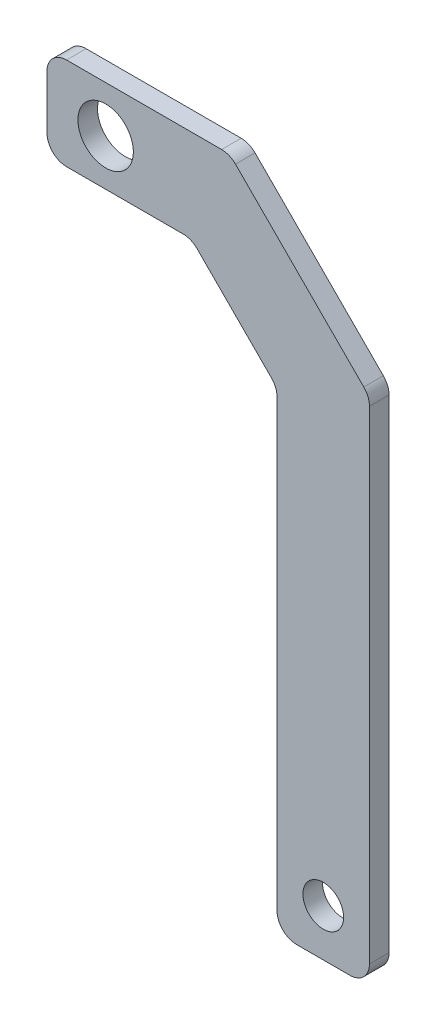
ISO-10303-21;
HEADER;
FILE_DESCRIPTION(('STEP AP214'),'2;1');
FILE_NAME('part.step','',(''),(''),'','','');
FILE_SCHEMA(('AUTOMOTIVE_DESIGN { 1 0 10303 214 1 1 1 1 }'));
ENDSEC;
DATA;
#1=APPLICATION_CONTEXT('core data for automotive mechanical design processes');
#2=APPLICATION_PROTOCOL_DEFINITION('international standard','automotive_design',2000,#1);
#3=PRODUCT_CONTEXT('',#1,'mechanical');
#4=PRODUCT('Part','Part','',(#3));
#5=PRODUCT_RELATED_PRODUCT_CATEGORY('part','',(#4));
#6=PRODUCT_DEFINITION_FORMATION('','',#4);
#7=PRODUCT_DEFINITION_CONTEXT('part definition',#1,'design');
#8=PRODUCT_DEFINITION('design','',#6,#7);
#9=PRODUCT_DEFINITION_SHAPE('','',#8);
#10=(LENGTH_UNIT() NAMED_UNIT(*) SI_UNIT(.MILLI.,.METRE.));
#11=(NAMED_UNIT(*) PLANE_ANGLE_UNIT() SI_UNIT($,.RADIAN.));
#12=(NAMED_UNIT(*) SI_UNIT($,.STERADIAN.) SOLID_ANGLE_UNIT());
#13=UNCERTAINTY_MEASURE_WITH_UNIT(LENGTH_MEASURE(1.E-05),#10,'distance_accuracy_value','');
#14=(GEOMETRIC_REPRESENTATION_CONTEXT(3) GLOBAL_UNCERTAINTY_ASSIGNED_CONTEXT((#13)) GLOBAL_UNIT_ASSIGNED_CONTEXT((#10,
#11,#12)) REPRESENTATION_CONTEXT('',''));
#15=CARTESIAN_POINT('',(0.,0.,0.));
#16=DIRECTION('',(0.,0.,1.));
#17=DIRECTION('',(1.,0.,0.));
#18=AXIS2_PLACEMENT_3D('',#15,#16,#17);
#19=CARTESIAN_POINT('',(0.,206.018608830238,3.175));
#20=DIRECTION('',(0.,-1.,0.));
#21=DIRECTION('',(0.,0.,-1.));
#22=AXIS2_PLACEMENT_3D('',#19,#20,#21);
#23=PLANE('',#22);
#24=DIRECTION('',(-1.,0.,0.));
#25=VECTOR('',#24,1.);
#26=CARTESIAN_POINT('',(0.,206.018608830238,0.));
#27=LINE('',#26,#25);
#28=CARTESIAN_POINT('',(-166.415166755522,206.018608830238,0.));
#29=VERTEX_POINT('',#28);
#30=CARTESIAN_POINT('',(-185.353932209541,206.018608830238,0.));
#31=VERTEX_POINT('',#30);
#32=EDGE_CURVE('E187',#29,#31,#27,.T.);
#33=ORIENTED_EDGE('',*,*,#32,.F.);
#34=DIRECTION('',(0.,0.,-1.));
#35=VECTOR('',#34,1.);
#36=CARTESIAN_POINT('',(-166.415166755522,206.018608830238,3.175));
#37=LINE('',#36,#35);
#38=CARTESIAN_POINT('',(-166.415166755522,206.018608830238,3.175));
#39=VERTEX_POINT('',#38);
#40=EDGE_CURVE('E211',#29,#39,#37,.F.);
#41=ORIENTED_EDGE('',*,*,#40,.T.);
#42=DIRECTION('',(-1.,0.,0.));
#43=VECTOR('',#42,1.);
#44=CARTESIAN_POINT('',(0.,206.018608830238,3.175));
#45=LINE('',#44,#43);
#46=CARTESIAN_POINT('',(-185.353932209541,206.018608830238,3.175));
#47=VERTEX_POINT('',#46);
#48=EDGE_CURVE('E202',#39,#47,#45,.T.);
#49=ORIENTED_EDGE('',*,*,#48,.T.);
#50=DIRECTION('',(0.,0.,-1.));
#51=VECTOR('',#50,1.);
#52=CARTESIAN_POINT('',(-185.353932209541,206.018608830238,3.175));
#53=LINE('',#52,#51);
#54=EDGE_CURVE('E208',#47,#31,#53,.T.);
#55=ORIENTED_EDGE('',*,*,#54,.T.);
#56=EDGE_LOOP('',(#33,#41,#49,#55));
#57=FACE_BOUND('',#56,.T.);
#58=ADVANCED_FACE('F39',(#57),#23,.T.);
#59=CARTESIAN_POINT('',(20.0933441758601,20.0042110443615,3.175));
#60=DIRECTION('',(0.708676862821959,0.705533205526732,0.));
#61=DIRECTION('',(-0.705533205526732,0.708676862821959,0.));
#62=AXIS2_PLACEMENT_3D('',#59,#60,#61);
#63=PLANE('',#62);
#64=DIRECTION('',(0.705533205526732,-0.708676862821959,0.));
#65=VECTOR('',#64,1.);
#66=CARTESIAN_POINT('',(20.0933441758601,20.0042110443615,0.));
#67=LINE('',#66,#65);
#68=CARTESIAN_POINT('',(-164.165117716062,205.083676757785,0.));
#69=VERTEX_POINT('',#68);
#70=CARTESIAN_POINT('',(-152.112823698461,192.977681111805,0.));
#71=VERTEX_POINT('',#70);
#72=EDGE_CURVE('E182',#69,#71,#67,.T.);
#73=ORIENTED_EDGE('',*,*,#72,.T.);
#74=DIRECTION('',(0.,0.,-1.));
#75=VECTOR('',#74,1.);
#76=CARTESIAN_POINT('',(-152.112823698461,192.977681111805,3.175));
#77=LINE('',#76,#75);
#78=CARTESIAN_POINT('',(-152.112823698461,192.977681111805,3.175));
#79=VERTEX_POINT('',#78);
#80=EDGE_CURVE('E158',#71,#79,#77,.F.);
#81=ORIENTED_EDGE('',*,*,#80,.T.);
#82=DIRECTION('',(0.705533205526732,-0.708676862821959,0.));
#83=VECTOR('',#82,1.);
#84=CARTESIAN_POINT('',(20.0933441758601,20.0042110443615,3.175));
#85=LINE('',#84,#83);
#86=CARTESIAN_POINT('',(-164.165117716062,205.083676757785,3.175));
#87=VERTEX_POINT('',#86);
#88=EDGE_CURVE('E274',#87,#79,#85,.T.);
#89=ORIENTED_EDGE('',*,*,#88,.F.);
#90=DIRECTION('',(0.,0.,-1.));
#91=VECTOR('',#90,1.);
#92=CARTESIAN_POINT('',(-164.165117716062,205.083676757785,3.175));
#93=LINE('',#92,#91);
#94=EDGE_CURVE('E174',#87,#69,#93,.T.);
#95=ORIENTED_EDGE('',*,*,#94,.T.);
#96=EDGE_LOOP('',(#73,#81,#89,#95));
#97=FACE_BOUND('',#96,.T.);
#98=ADVANCED_FACE('F276',(#97),#63,.F.);
#99=CARTESIAN_POINT('',(-151.187872737921,0.,3.175));
#100=DIRECTION('',(1.,0.,0.));
#101=DIRECTION('',(0.,0.,-1.));
#102=AXIS2_PLACEMENT_3D('',#99,#100,#101);
#103=PLANE('',#102);
#104=DIRECTION('',(0.,-1.,0.));
#105=VECTOR('',#104,1.);
#106=CARTESIAN_POINT('',(-151.187872737921,0.,3.175));
#107=LINE('',#106,#105);
#108=CARTESIAN_POINT('',(-151.187872737921,190.737613184257,3.175));
#109=VERTEX_POINT('',#108);
#110=CARTESIAN_POINT('',(-151.187872737921,118.541389998239,3.175));
#111=VERTEX_POINT('',#110);
#112=EDGE_CURVE('E173',#109,#111,#107,.T.);
#113=ORIENTED_EDGE('',*,*,#112,.F.);
#114=DIRECTION('',(0.,0.,-1.));
#115=VECTOR('',#114,1.);
#116=CARTESIAN_POINT('',(-151.187872737921,190.737613184257,0.));
#117=LINE('',#116,#115);
#118=CARTESIAN_POINT('',(-151.187872737921,190.737613184257,0.));
#119=VERTEX_POINT('',#118);
#120=EDGE_CURVE('E157',#109,#119,#117,.T.);
#121=ORIENTED_EDGE('',*,*,#120,.T.);
#122=DIRECTION('',(0.,-1.,0.));
#123=VECTOR('',#122,1.);
#124=CARTESIAN_POINT('',(-151.187872737921,0.,0.));
#125=LINE('',#124,#123);
#126=CARTESIAN_POINT('',(-151.187872737921,118.541389998239,0.));
#127=VERTEX_POINT('',#126);
#128=EDGE_CURVE('E170',#119,#127,#125,.T.);
#129=ORIENTED_EDGE('',*,*,#128,.T.);
#130=DIRECTION('',(0.,0.,-1.));
#131=VECTOR('',#130,1.);
#132=CARTESIAN_POINT('',(-151.187872737921,118.541389998239,3.175));
#133=LINE('',#132,#131);
#134=EDGE_CURVE('E175',#127,#111,#133,.F.);
#135=ORIENTED_EDGE('',*,*,#134,.T.);
#136=EDGE_LOOP('',(#113,#121,#129,#135));
#137=FACE_BOUND('',#136,.T.);
#138=ADVANCED_FACE('F169',(#137),#103,.F.);
#139=CARTESIAN_POINT('',(0.,115.366389998239,3.175));
#140=DIRECTION('',(0.,1.,0.));
#141=DIRECTION('',(0.,0.,1.));
#142=AXIS2_PLACEMENT_3D('',#139,#140,#141);
#143=PLANE('',#142);
#144=DIRECTION('',(1.,0.,0.));
#145=VECTOR('',#144,1.);
#146=CARTESIAN_POINT('',(0.,115.366389998239,3.175));
#147=LINE('',#146,#145);
#148=CARTESIAN_POINT('',(-148.012872737921,115.366389998239,3.175));
#149=VERTEX_POINT('',#148);
#150=CARTESIAN_POINT('',(-139.362872737921,115.366389998239,3.175));
#151=VERTEX_POINT('',#150);
#152=EDGE_CURVE('E278',#149,#151,#147,.T.);
#153=ORIENTED_EDGE('',*,*,#152,.F.);
#154=DIRECTION('',(0.,0.,-1.));
#155=VECTOR('',#154,1.);
#156=CARTESIAN_POINT('',(-148.012872737921,115.366389998239,3.175));
#157=LINE('',#156,#155);
#158=CARTESIAN_POINT('',(-148.012872737921,115.366389998239,0.));
#159=VERTEX_POINT('',#158);
#160=EDGE_CURVE('E164',#149,#159,#157,.T.);
#161=ORIENTED_EDGE('',*,*,#160,.T.);
#162=DIRECTION('',(1.,0.,0.));
#163=VECTOR('',#162,1.);
#164=CARTESIAN_POINT('',(0.,115.366389998239,0.));
#165=LINE('',#164,#163);
#166=CARTESIAN_POINT('',(-139.362872737921,115.366389998239,0.));
#167=VERTEX_POINT('',#166);
#168=EDGE_CURVE('E181',#159,#167,#165,.T.);
#169=ORIENTED_EDGE('',*,*,#168,.T.);
#170=DIRECTION('',(0.,0.,-1.));
#171=VECTOR('',#170,1.);
#172=CARTESIAN_POINT('',(-139.362872737921,115.366389998239,3.175));
#173=LINE('',#172,#171);
#174=EDGE_CURVE('E254',#167,#151,#173,.F.);
#175=ORIENTED_EDGE('',*,*,#174,.T.);
#176=EDGE_LOOP('',(#153,#161,#169,#175));
#177=FACE_BOUND('',#176,.T.);
#178=ADVANCED_FACE('F325',(#177),#143,.F.);
#179=CARTESIAN_POINT('',(-136.187872737921,0.,3.175));
#180=DIRECTION('',(-1.,0.,0.));
#181=DIRECTION('',(0.,0.,1.));
#182=AXIS2_PLACEMENT_3D('',#179,#180,#181);
#183=PLANE('',#182);
#184=DIRECTION('',(0.,1.,0.));
#185=VECTOR('',#184,1.);
#186=CARTESIAN_POINT('',(-136.187872737921,0.,0.));
#187=LINE('',#186,#185);
#188=CARTESIAN_POINT('',(-136.187872737921,118.541389998239,0.));
#189=VERTEX_POINT('',#188);
#190=CARTESIAN_POINT('',(-136.187872737921,196.931293401489,0.));
#191=VERTEX_POINT('',#190);
#192=EDGE_CURVE('E185',#189,#191,#187,.T.);
#193=ORIENTED_EDGE('',*,*,#192,.T.);
#194=DIRECTION('',(0.,0.,-1.));
#195=VECTOR('',#194,1.);
#196=CARTESIAN_POINT('',(-136.187872737921,196.931293401489,3.175));
#197=LINE('',#196,#195);
#198=CARTESIAN_POINT('',(-136.187872737921,196.931293401489,3.175));
#199=VERTEX_POINT('',#198);
#200=EDGE_CURVE('E248',#191,#199,#197,.F.);
#201=ORIENTED_EDGE('',*,*,#200,.T.);
#202=DIRECTION('',(0.,1.,0.));
#203=VECTOR('',#202,1.);
#204=CARTESIAN_POINT('',(-136.187872737921,0.,3.175));
#205=LINE('',#204,#203);
#206=CARTESIAN_POINT('',(-136.187872737921,118.541389998239,3.175));
#207=VERTEX_POINT('',#206);
#208=EDGE_CURVE('E285',#207,#199,#205,.T.);
#209=ORIENTED_EDGE('',*,*,#208,.F.);
#210=DIRECTION('',(0.,0.,-1.));
#211=VECTOR('',#210,1.);
#212=CARTESIAN_POINT('',(-136.187872737921,118.541389998239,3.175));
#213=LINE('',#212,#211);
#214=EDGE_CURVE('E245',#207,#189,#213,.T.);
#215=ORIENTED_EDGE('',*,*,#214,.T.);
#216=EDGE_LOOP('',(#193,#201,#209,#215));
#217=FACE_BOUND('',#216,.T.);
#218=ADVANCED_FACE('F317',(#217),#183,.F.);
#219=CARTESIAN_POINT('',(30.7234971181895,30.5872091272625,3.175));
#220=DIRECTION('',(-0.708676862821959,-0.705533205526732,0.));
#221=DIRECTION('',(0.705533205526732,-0.708676862821959,0.));
#222=AXIS2_PLACEMENT_3D('',#219,#220,#221);
#223=PLANE('',#222);
#224=DIRECTION('',(-0.705533205526732,0.708676862821959,0.));
#225=VECTOR('',#224,1.);
#226=CARTESIAN_POINT('',(30.7234971181895,30.5872091272625,0.));
#227=LINE('',#226,#225);
#228=CARTESIAN_POINT('',(-137.112823698461,199.171361329036,0.));
#229=VERTEX_POINT('',#228);
#230=CARTESIAN_POINT('',(-157.93237307768,220.083676757785,0.));
#231=VERTEX_POINT('',#230);
#232=EDGE_CURVE('E193',#229,#231,#227,.T.);
#233=ORIENTED_EDGE('',*,*,#232,.T.);
#234=DIRECTION('',(0.,0.,-1.));
#235=VECTOR('',#234,1.);
#236=CARTESIAN_POINT('',(-157.93237307768,220.083676757785,3.175));
#237=LINE('',#236,#235);
#238=CARTESIAN_POINT('',(-157.93237307768,220.083676757785,3.175));
#239=VERTEX_POINT('',#238);
#240=EDGE_CURVE('E232',#231,#239,#237,.F.);
#241=ORIENTED_EDGE('',*,*,#240,.T.);
#242=DIRECTION('',(-0.705533205526732,0.708676862821959,0.));
#243=VECTOR('',#242,1.);
#244=CARTESIAN_POINT('',(30.7234971181895,30.5872091272625,3.175));
#245=LINE('',#244,#243);
#246=CARTESIAN_POINT('',(-137.112823698461,199.171361329036,3.175));
#247=VERTEX_POINT('',#246);
#248=EDGE_CURVE('E288',#247,#239,#245,.T.);
#249=ORIENTED_EDGE('',*,*,#248,.F.);
#250=DIRECTION('',(0.,0.,-1.));
#251=VECTOR('',#250,1.);
#252=CARTESIAN_POINT('',(-137.112823698461,199.171361329036,3.175));
#253=LINE('',#252,#251);
#254=EDGE_CURVE('E229',#247,#229,#253,.T.);
#255=ORIENTED_EDGE('',*,*,#254,.T.);
#256=EDGE_LOOP('',(#233,#241,#249,#255));
#257=FACE_BOUND('',#256,.T.);
#258=ADVANCED_FACE('F308',(#257),#223,.F.);
#259=CARTESIAN_POINT('',(0.,221.018608830238,3.175));
#260=DIRECTION('',(0.,-1.,0.));
#261=DIRECTION('',(0.,0.,-1.));
#262=AXIS2_PLACEMENT_3D('',#259,#260,#261);
#263=PLANE('',#262);
#264=DIRECTION('',(-1.,0.,0.));
#265=VECTOR('',#264,1.);
#266=CARTESIAN_POINT('',(0.,221.018608830238,3.175));
#267=LINE('',#266,#265);
#268=CARTESIAN_POINT('',(-160.18242211714,221.018608830238,3.175));
#269=VERTEX_POINT('',#268);
#270=CARTESIAN_POINT('',(-185.353932209541,221.018608830238,3.175));
#271=VERTEX_POINT('',#270);
#272=EDGE_CURVE('E290',#269,#271,#267,.T.);
#273=ORIENTED_EDGE('',*,*,#272,.F.);
#274=DIRECTION('',(0.,0.,-1.));
#275=VECTOR('',#274,1.);
#276=CARTESIAN_POINT('',(-160.18242211714,221.018608830238,3.175));
#277=LINE('',#276,#275);
#278=CARTESIAN_POINT('',(-160.18242211714,221.018608830238,0.));
#279=VERTEX_POINT('',#278);
#280=EDGE_CURVE('E215',#269,#279,#277,.T.);
#281=ORIENTED_EDGE('',*,*,#280,.T.);
#282=DIRECTION('',(-1.,0.,0.));
#283=VECTOR('',#282,1.);
#284=CARTESIAN_POINT('',(0.,221.018608830238,0.));
#285=LINE('',#284,#283);
#286=CARTESIAN_POINT('',(-185.353932209541,221.018608830238,0.));
#287=VERTEX_POINT('',#286);
#288=EDGE_CURVE('E196',#279,#287,#285,.T.);
#289=ORIENTED_EDGE('',*,*,#288,.T.);
#290=DIRECTION('',(0.,0.,-1.));
#291=VECTOR('',#290,1.);
#292=CARTESIAN_POINT('',(-185.353932209541,221.018608830238,3.175));
#293=LINE('',#292,#291);
#294=EDGE_CURVE('E213',#287,#271,#293,.F.);
#295=ORIENTED_EDGE('',*,*,#294,.T.);
#296=EDGE_LOOP('',(#273,#281,#289,#295));
#297=FACE_BOUND('',#296,.T.);
#298=ADVANCED_FACE('F300',(#297),#263,.F.);
#299=CARTESIAN_POINT('',(-188.528932209541,0.,3.175));
#300=DIRECTION('',(-1.,0.,0.));
#301=DIRECTION('',(0.,0.,1.));
#302=AXIS2_PLACEMENT_3D('',#299,#300,#301);
#303=PLANE('',#302);
#304=DIRECTION('',(0.,1.,0.));
#305=VECTOR('',#304,1.);
#306=CARTESIAN_POINT('',(-188.528932209541,0.,3.175));
#307=LINE('',#306,#305);
#308=CARTESIAN_POINT('',(-188.528932209541,209.193608830238,3.175));
#309=VERTEX_POINT('',#308);
#310=CARTESIAN_POINT('',(-188.528932209541,217.843608830238,3.175));
#311=VERTEX_POINT('',#310);
#312=EDGE_CURVE('E203',#309,#311,#307,.T.);
#313=ORIENTED_EDGE('',*,*,#312,.T.);
#314=DIRECTION('',(0.,0.,-1.));
#315=VECTOR('',#314,1.);
#316=CARTESIAN_POINT('',(-188.528932209541,217.843608830238,0.));
#317=LINE('',#316,#315);
#318=CARTESIAN_POINT('',(-188.528932209541,217.843608830238,0.));
#319=VERTEX_POINT('',#318);
#320=EDGE_CURVE('E251',#311,#319,#317,.T.);
#321=ORIENTED_EDGE('',*,*,#320,.T.);
#322=DIRECTION('',(0.,1.,0.));
#323=VECTOR('',#322,1.);
#324=CARTESIAN_POINT('',(-188.528932209541,0.,0.));
#325=LINE('',#324,#323);
#326=CARTESIAN_POINT('',(-188.528932209541,209.193608830238,0.));
#327=VERTEX_POINT('',#326);
#328=EDGE_CURVE('E199',#327,#319,#325,.T.);
#329=ORIENTED_EDGE('',*,*,#328,.F.);
#330=DIRECTION('',(0.,0.,-1.));
#331=VECTOR('',#330,1.);
#332=CARTESIAN_POINT('',(-188.528932209541,209.193608830238,3.175));
#333=LINE('',#332,#331);
#334=EDGE_CURVE('E61',#327,#309,#333,.F.);
#335=ORIENTED_EDGE('',*,*,#334,.T.);
#336=EDGE_LOOP('',(#313,#321,#329,#335));
#337=FACE_BOUND('',#336,.T.);
#338=ADVANCED_FACE('F293',(#337),#303,.T.);
#339=CARTESIAN_POINT('',(0.,0.,3.175));
#340=DIRECTION('',(0.,0.,1.));
#341=DIRECTION('',(1.,0.,0.));
#342=AXIS2_PLACEMENT_3D('',#339,#340,#341);
#343=PLANE('',#342);
#344=CARTESIAN_POINT('',(-179.003932209541,213.518608830238,3.175));
#345=DIRECTION('',(0.,0.,1.));
#346=DIRECTION('',(1.,0.,0.));
#347=AXIS2_PLACEMENT_3D('',#344,#345,#346);
#348=CIRCLE('',#347,4.49999999999998);
#349=CARTESIAN_POINT('',(-174.503932209541,213.518608830238,3.175));
#350=VERTEX_POINT('',#349);
#351=EDGE_CURVE('E564',#350,#350,#348,.T.);
#352=ORIENTED_EDGE('',*,*,#351,.F.);
#353=EDGE_LOOP('',(#352));
#354=FACE_BOUND('',#353,.T.);
#355=CARTESIAN_POINT('',(-143.687872737923,122.986389998247,3.175));
#356=DIRECTION('',(0.,0.,1.));
#357=DIRECTION('',(1.,0.,0.));
#358=AXIS2_PLACEMENT_3D('',#355,#356,#357);
#359=CIRCLE('',#358,3.3);
#360=CARTESIAN_POINT('',(-140.387872737923,122.986389998247,3.175));
#361=VERTEX_POINT('',#360);
#362=EDGE_CURVE('E559',#361,#361,#359,.T.);
#363=ORIENTED_EDGE('',*,*,#362,.F.);
#364=EDGE_LOOP('',(#363));
#365=FACE_BOUND('',#364,.T.);
#366=ORIENTED_EDGE('',*,*,#248,.T.);
#367=CARTESIAN_POINT('',(-160.18242211714,217.843608830238,3.175));
#368=DIRECTION('',(0.,0.,1.));
#369=DIRECTION('',(1.,0.,0.));
#370=AXIS2_PLACEMENT_3D('',#367,#368,#369);
#371=CIRCLE('',#370,3.175);
#372=EDGE_CURVE('E243',#239,#269,#371,.T.);
#373=ORIENTED_EDGE('',*,*,#372,.T.);
#374=ORIENTED_EDGE('',*,*,#272,.T.);
#375=CARTESIAN_POINT('',(-185.353932209541,217.843608830238,3.175));
#376=DIRECTION('',(0.,0.,1.));
#377=DIRECTION('',(1.,0.,0.));
#378=AXIS2_PLACEMENT_3D('',#375,#376,#377);
#379=CIRCLE('',#378,3.175);
#380=EDGE_CURVE('E54',#271,#311,#379,.T.);
#381=ORIENTED_EDGE('',*,*,#380,.T.);
#382=ORIENTED_EDGE('',*,*,#312,.F.);
#383=CARTESIAN_POINT('',(-185.353932209541,209.193608830238,3.175));
#384=DIRECTION('',(0.,0.,1.));
#385=DIRECTION('',(1.,0.,0.));
#386=AXIS2_PLACEMENT_3D('',#383,#384,#385);
#387=CIRCLE('',#386,3.175);
#388=EDGE_CURVE('E238',#309,#47,#387,.T.);
#389=ORIENTED_EDGE('',*,*,#388,.T.);
#390=ORIENTED_EDGE('',*,*,#48,.F.);
#391=CARTESIAN_POINT('',(-166.415166755522,202.843608830238,3.175));
#392=DIRECTION('',(0.,0.,1.));
#393=DIRECTION('',(1.,0.,0.));
#394=AXIS2_PLACEMENT_3D('',#391,#392,#393);
#395=CIRCLE('',#394,3.175);
#396=EDGE_CURVE('E11',#39,#87,#395,.F.);
#397=ORIENTED_EDGE('',*,*,#396,.T.);
#398=ORIENTED_EDGE('',*,*,#88,.T.);
#399=CARTESIAN_POINT('',(-154.362872737921,190.737613184257,3.175));
#400=DIRECTION('',(0.,0.,1.));
#401=DIRECTION('',(1.,0.,0.));
#402=AXIS2_PLACEMENT_3D('',#399,#400,#401);
#403=CIRCLE('',#402,3.175);
#404=EDGE_CURVE('E163',#79,#109,#403,.F.);
#405=ORIENTED_EDGE('',*,*,#404,.T.);
#406=ORIENTED_EDGE('',*,*,#112,.T.);
#407=CARTESIAN_POINT('',(-148.012872737921,118.541389998239,3.175));
#408=DIRECTION('',(0.,0.,1.));
#409=DIRECTION('',(1.,0.,0.));
#410=AXIS2_PLACEMENT_3D('',#407,#408,#409);
#411=CIRCLE('',#410,3.175);
#412=EDGE_CURVE('E236',#111,#149,#411,.T.);
#413=ORIENTED_EDGE('',*,*,#412,.T.);
#414=ORIENTED_EDGE('',*,*,#152,.T.);
#415=CARTESIAN_POINT('',(-139.362872737921,118.541389998239,3.175));
#416=DIRECTION('',(0.,0.,1.));
#417=DIRECTION('',(1.,0.,0.));
#418=AXIS2_PLACEMENT_3D('',#415,#416,#417);
#419=CIRCLE('',#418,3.175);
#420=EDGE_CURVE('E234',#151,#207,#419,.T.);
#421=ORIENTED_EDGE('',*,*,#420,.T.);
#422=ORIENTED_EDGE('',*,*,#208,.T.);
#423=CARTESIAN_POINT('',(-139.362872737921,196.931293401489,3.175));
#424=DIRECTION('',(0.,0.,1.));
#425=DIRECTION('',(1.,0.,0.));
#426=AXIS2_PLACEMENT_3D('',#423,#424,#425);
#427=CIRCLE('',#426,3.175);
#428=EDGE_CURVE('E241',#199,#247,#427,.T.);
#429=ORIENTED_EDGE('',*,*,#428,.T.);
#430=EDGE_LOOP('',(#366,#373,#374,#381,#382,#389,#390,#397,#398,#405,#406,#413,#414,#421,#422,#429));
#431=FACE_BOUND('',#430,.T.);
#432=ADVANCED_FACE('F273',(#354,#365,#431),#343,.T.);
#433=CARTESIAN_POINT('',(0.,0.,0.));
#434=DIRECTION('',(0.,0.,1.));
#435=DIRECTION('',(1.,0.,0.));
#436=AXIS2_PLACEMENT_3D('',#433,#434,#435);
#437=PLANE('',#436);
#438=CARTESIAN_POINT('',(-179.003932209541,213.518608830238,0.));
#439=DIRECTION('',(0.,0.,1.));
#440=DIRECTION('',(1.,0.,0.));
#441=AXIS2_PLACEMENT_3D('',#438,#439,#440);
#442=CIRCLE('',#441,4.5);
#443=CARTESIAN_POINT('',(-174.503932209541,213.518608830238,0.));
#444=VERTEX_POINT('',#443);
#445=EDGE_CURVE('E561',#444,#444,#442,.T.);
#446=ORIENTED_EDGE('',*,*,#445,.T.);
#447=EDGE_LOOP('',(#446));
#448=FACE_BOUND('',#447,.T.);
#449=CARTESIAN_POINT('',(-143.687872737923,122.986389998247,0.));
#450=DIRECTION('',(0.,0.,1.));
#451=DIRECTION('',(1.,0.,0.));
#452=AXIS2_PLACEMENT_3D('',#449,#450,#451);
#453=CIRCLE('',#452,3.3);
#454=CARTESIAN_POINT('',(-140.387872737923,122.986389998247,0.));
#455=VERTEX_POINT('',#454);
#456=EDGE_CURVE('E267',#455,#455,#453,.T.);
#457=ORIENTED_EDGE('',*,*,#456,.T.);
#458=EDGE_LOOP('',(#457));
#459=FACE_BOUND('',#458,.T.);
#460=ORIENTED_EDGE('',*,*,#288,.F.);
#461=CARTESIAN_POINT('',(-160.18242211714,217.843608830238,0.));
#462=DIRECTION('',(0.,0.,1.));
#463=DIRECTION('',(1.,0.,0.));
#464=AXIS2_PLACEMENT_3D('',#461,#462,#463);
#465=CIRCLE('',#464,3.175);
#466=EDGE_CURVE('E227',#279,#231,#465,.F.);
#467=ORIENTED_EDGE('',*,*,#466,.T.);
#468=ORIENTED_EDGE('',*,*,#232,.F.);
#469=CARTESIAN_POINT('',(-139.362872737921,196.931293401489,0.));
#470=DIRECTION('',(0.,0.,1.));
#471=DIRECTION('',(1.,0.,0.));
#472=AXIS2_PLACEMENT_3D('',#469,#470,#471);
#473=CIRCLE('',#472,3.175);
#474=EDGE_CURVE('E225',#229,#191,#473,.F.);
#475=ORIENTED_EDGE('',*,*,#474,.T.);
#476=ORIENTED_EDGE('',*,*,#192,.F.);
#477=CARTESIAN_POINT('',(-139.362872737921,118.541389998239,0.));
#478=DIRECTION('',(0.,0.,1.));
#479=DIRECTION('',(1.,0.,0.));
#480=AXIS2_PLACEMENT_3D('',#477,#478,#479);
#481=CIRCLE('',#480,3.175);
#482=EDGE_CURVE('E218',#189,#167,#481,.F.);
#483=ORIENTED_EDGE('',*,*,#482,.T.);
#484=ORIENTED_EDGE('',*,*,#168,.F.);
#485=CARTESIAN_POINT('',(-148.012872737921,118.541389998239,0.));
#486=DIRECTION('',(0.,0.,1.));
#487=DIRECTION('',(1.,0.,0.));
#488=AXIS2_PLACEMENT_3D('',#485,#486,#487);
#489=CIRCLE('',#488,3.175);
#490=EDGE_CURVE('E180',#159,#127,#489,.F.);
#491=ORIENTED_EDGE('',*,*,#490,.T.);
#492=ORIENTED_EDGE('',*,*,#128,.F.);
#493=CARTESIAN_POINT('',(-154.362872737921,190.737613184257,0.));
#494=DIRECTION('',(0.,0.,1.));
#495=DIRECTION('',(1.,0.,0.));
#496=AXIS2_PLACEMENT_3D('',#493,#494,#495);
#497=CIRCLE('',#496,3.175);
#498=EDGE_CURVE('E153',#119,#71,#497,.T.);
#499=ORIENTED_EDGE('',*,*,#498,.T.);
#500=ORIENTED_EDGE('',*,*,#72,.F.);
#501=CARTESIAN_POINT('',(-166.415166755522,202.843608830238,0.));
#502=DIRECTION('',(0.,0.,1.));
#503=DIRECTION('',(1.,0.,0.));
#504=AXIS2_PLACEMENT_3D('',#501,#502,#503);
#505=CIRCLE('',#504,3.175);
#506=EDGE_CURVE('E47',#69,#29,#505,.T.);
#507=ORIENTED_EDGE('',*,*,#506,.T.);
#508=ORIENTED_EDGE('',*,*,#32,.T.);
#509=CARTESIAN_POINT('',(-185.353932209541,209.193608830238,0.));
#510=DIRECTION('',(0.,0.,1.));
#511=DIRECTION('',(1.,0.,0.));
#512=AXIS2_PLACEMENT_3D('',#509,#510,#511);
#513=CIRCLE('',#512,3.175);
#514=EDGE_CURVE('E221',#31,#327,#513,.F.);
#515=ORIENTED_EDGE('',*,*,#514,.T.);
#516=ORIENTED_EDGE('',*,*,#328,.T.);
#517=CARTESIAN_POINT('',(-185.353932209541,217.843608830238,0.));
#518=DIRECTION('',(0.,0.,1.));
#519=DIRECTION('',(1.,0.,0.));
#520=AXIS2_PLACEMENT_3D('',#517,#518,#519);
#521=CIRCLE('',#520,3.175);
#522=EDGE_CURVE('E223',#319,#287,#521,.F.);
#523=ORIENTED_EDGE('',*,*,#522,.T.);
#524=EDGE_LOOP('',(#460,#467,#468,#475,#476,#483,#484,#491,#492,#499,#500,#507,#508,#515,#516,#523));
#525=FACE_BOUND('',#524,.T.);
#526=ADVANCED_FACE('F178',(#448,#459,#525),#437,.F.);
#527=CARTESIAN_POINT('',(-143.687872737923,122.986389998247,3.175));
#528=DIRECTION('',(0.,0.,1.));
#529=DIRECTION('',(1.,0.,0.));
#530=AXIS2_PLACEMENT_3D('',#527,#528,#529);
#531=CYLINDRICAL_SURFACE('',#530,3.3);
#532=ORIENTED_EDGE('',*,*,#456,.F.);
#533=EDGE_LOOP('',(#532));
#534=FACE_BOUND('',#533,.T.);
#535=ORIENTED_EDGE('',*,*,#362,.T.);
#536=EDGE_LOOP('',(#535));
#537=FACE_BOUND('',#536,.T.);
#538=ADVANCED_FACE('F349',(#534,#537),#531,.F.);
#539=CARTESIAN_POINT('',(-154.362872737921,190.737613184257,3.175));
#540=DIRECTION('',(0.,0.,1.));
#541=DIRECTION('',(1.,0.,0.));
#542=AXIS2_PLACEMENT_3D('',#539,#540,#541);
#543=CYLINDRICAL_SURFACE('',#542,3.175);
#544=ORIENTED_EDGE('',*,*,#404,.F.);
#545=ORIENTED_EDGE('',*,*,#80,.F.);
#546=ORIENTED_EDGE('',*,*,#498,.F.);
#547=ORIENTED_EDGE('',*,*,#120,.F.);
#548=EDGE_LOOP('',(#544,#545,#546,#547));
#549=FACE_BOUND('',#548,.T.);
#550=ADVANCED_FACE('F156',(#549),#543,.F.);
#551=CARTESIAN_POINT('',(-166.415166755522,202.843608830238,3.175));
#552=DIRECTION('',(0.,0.,-1.));
#553=DIRECTION('',(-1.,0.,0.));
#554=AXIS2_PLACEMENT_3D('',#551,#552,#553);
#555=CYLINDRICAL_SURFACE('',#554,3.175);
#556=ORIENTED_EDGE('',*,*,#396,.F.);
#557=ORIENTED_EDGE('',*,*,#40,.F.);
#558=ORIENTED_EDGE('',*,*,#506,.F.);
#559=ORIENTED_EDGE('',*,*,#94,.F.);
#560=EDGE_LOOP('',(#556,#557,#558,#559));
#561=FACE_BOUND('',#560,.T.);
#562=ADVANCED_FACE('F269',(#561),#555,.F.);
#563=CARTESIAN_POINT('',(-160.18242211714,217.843608830238,3.175));
#564=DIRECTION('',(0.,0.,-1.));
#565=DIRECTION('',(-1.,0.,0.));
#566=AXIS2_PLACEMENT_3D('',#563,#564,#565);
#567=CYLINDRICAL_SURFACE('',#566,3.175);
#568=ORIENTED_EDGE('',*,*,#372,.F.);
#569=ORIENTED_EDGE('',*,*,#240,.F.);
#570=ORIENTED_EDGE('',*,*,#466,.F.);
#571=ORIENTED_EDGE('',*,*,#280,.F.);
#572=EDGE_LOOP('',(#568,#569,#570,#571));
#573=FACE_BOUND('',#572,.T.);
#574=ADVANCED_FACE('F304',(#573),#567,.T.);
#575=CARTESIAN_POINT('',(-139.362872737921,196.931293401489,3.175));
#576=DIRECTION('',(0.,0.,-1.));
#577=DIRECTION('',(-1.,0.,0.));
#578=AXIS2_PLACEMENT_3D('',#575,#576,#577);
#579=CYLINDRICAL_SURFACE('',#578,3.175);
#580=ORIENTED_EDGE('',*,*,#428,.F.);
#581=ORIENTED_EDGE('',*,*,#200,.F.);
#582=ORIENTED_EDGE('',*,*,#474,.F.);
#583=ORIENTED_EDGE('',*,*,#254,.F.);
#584=EDGE_LOOP('',(#580,#581,#582,#583));
#585=FACE_BOUND('',#584,.T.);
#586=ADVANCED_FACE('F313',(#585),#579,.T.);
#587=CARTESIAN_POINT('',(-185.353932209541,217.843608830238,3.175));
#588=DIRECTION('',(0.,0.,1.));
#589=DIRECTION('',(1.,0.,0.));
#590=AXIS2_PLACEMENT_3D('',#587,#588,#589);
#591=CYLINDRICAL_SURFACE('',#590,3.175);
#592=ORIENTED_EDGE('',*,*,#380,.F.);
#593=ORIENTED_EDGE('',*,*,#294,.F.);
#594=ORIENTED_EDGE('',*,*,#522,.F.);
#595=ORIENTED_EDGE('',*,*,#320,.F.);
#596=EDGE_LOOP('',(#592,#593,#594,#595));
#597=FACE_BOUND('',#596,.T.);
#598=ADVANCED_FACE('F296',(#597),#591,.T.);
#599=CARTESIAN_POINT('',(-185.353932209541,209.193608830238,3.175));
#600=DIRECTION('',(0.,0.,-1.));
#601=DIRECTION('',(-1.,0.,0.));
#602=AXIS2_PLACEMENT_3D('',#599,#600,#601);
#603=CYLINDRICAL_SURFACE('',#602,3.175);
#604=ORIENTED_EDGE('',*,*,#388,.F.);
#605=ORIENTED_EDGE('',*,*,#334,.F.);
#606=ORIENTED_EDGE('',*,*,#514,.F.);
#607=ORIENTED_EDGE('',*,*,#54,.F.);
#608=EDGE_LOOP('',(#604,#605,#606,#607));
#609=FACE_BOUND('',#608,.T.);
#610=ADVANCED_FACE('F331',(#609),#603,.T.);
#611=CARTESIAN_POINT('',(-148.012872737921,118.541389998239,3.175));
#612=DIRECTION('',(0.,0.,-1.));
#613=DIRECTION('',(-1.,0.,0.));
#614=AXIS2_PLACEMENT_3D('',#611,#612,#613);
#615=CYLINDRICAL_SURFACE('',#614,3.175);
#616=ORIENTED_EDGE('',*,*,#412,.F.);
#617=ORIENTED_EDGE('',*,*,#134,.F.);
#618=ORIENTED_EDGE('',*,*,#490,.F.);
#619=ORIENTED_EDGE('',*,*,#160,.F.);
#620=EDGE_LOOP('',(#616,#617,#618,#619));
#621=FACE_BOUND('',#620,.T.);
#622=ADVANCED_FACE('F329',(#621),#615,.T.);
#623=CARTESIAN_POINT('',(-139.362872737921,118.541389998239,3.175));
#624=DIRECTION('',(0.,0.,-1.));
#625=DIRECTION('',(-1.,0.,0.));
#626=AXIS2_PLACEMENT_3D('',#623,#624,#625);
#627=CYLINDRICAL_SURFACE('',#626,3.175);
#628=ORIENTED_EDGE('',*,*,#420,.F.);
#629=ORIENTED_EDGE('',*,*,#174,.F.);
#630=ORIENTED_EDGE('',*,*,#482,.F.);
#631=ORIENTED_EDGE('',*,*,#214,.F.);
#632=EDGE_LOOP('',(#628,#629,#630,#631));
#633=FACE_BOUND('',#632,.T.);
#634=ADVANCED_FACE('F41',(#633),#627,.T.);
#635=CARTESIAN_POINT('',(-179.003932209541,213.518608830238,3.175));
#636=DIRECTION('',(0.,0.,1.));
#637=DIRECTION('',(1.,0.,0.));
#638=AXIS2_PLACEMENT_3D('',#635,#636,#637);
#639=CYLINDRICAL_SURFACE('',#638,4.49999999999999);
#640=ORIENTED_EDGE('',*,*,#445,.F.);
#641=EDGE_LOOP('',(#640));
#642=FACE_BOUND('',#641,.T.);
#643=ORIENTED_EDGE('',*,*,#351,.T.);
#644=EDGE_LOOP('',(#643));
#645=FACE_BOUND('',#644,.T.);
#646=ADVANCED_FACE('F336',(#642,#645),#639,.F.);
#647=CLOSED_SHELL('',(#58,#98,#138,#178,#218,#258,#298,#338,#432,#526,#538,#550,#562,#574,#586,
#598,#610,#622,#634,#646));
#648=MANIFOLD_SOLID_BREP('B2',#647);
#649=ADVANCED_BREP_SHAPE_REPRESENTATION('',(#18,#648),#14);
#650=SHAPE_DEFINITION_REPRESENTATION(#9,#649);
ENDSEC;
END-ISO-10303-21;
